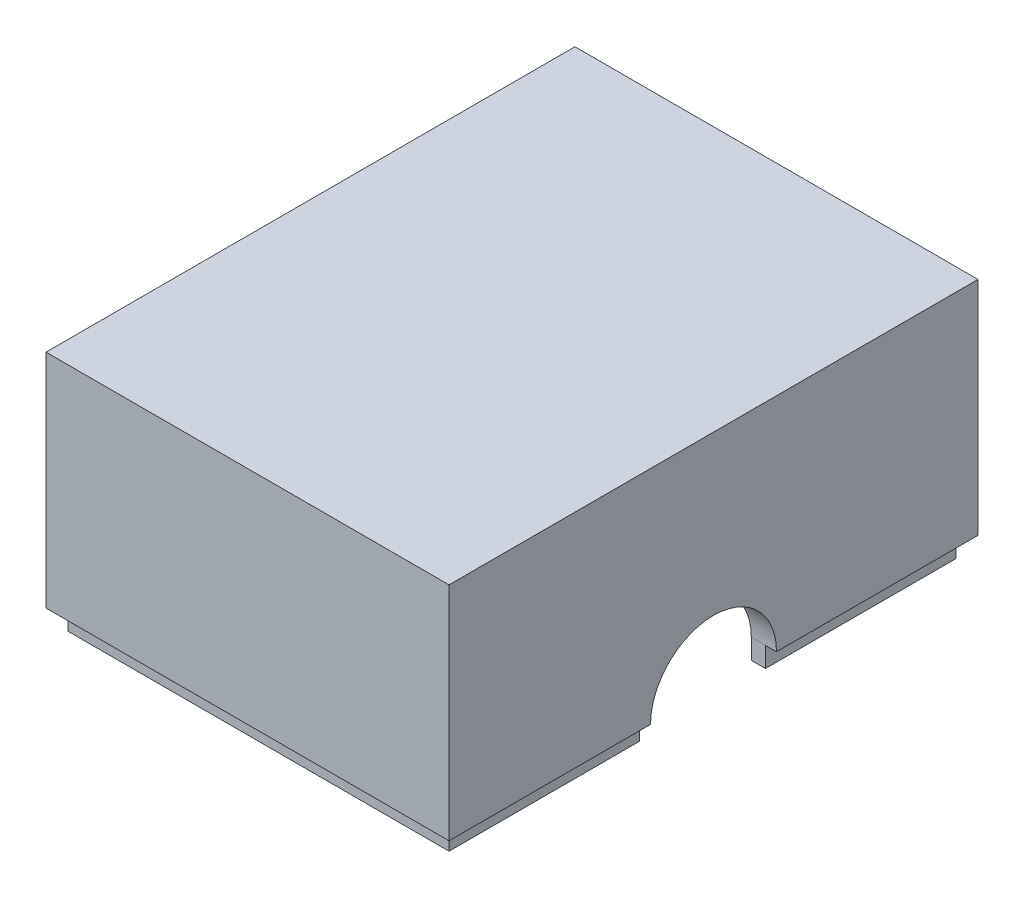
ISO-10303-21;
HEADER;
FILE_DESCRIPTION(('STEP AP214'),'2;1');
FILE_NAME('part.step','',(''),(''),'','','');
FILE_SCHEMA(('AUTOMOTIVE_DESIGN { 1 0 10303 214 1 1 1 1 }'));
ENDSEC;
DATA;
#1=APPLICATION_CONTEXT('core data for automotive mechanical design processes');
#2=APPLICATION_PROTOCOL_DEFINITION('international standard','automotive_design',2000,#1);
#3=PRODUCT_CONTEXT('',#1,'mechanical');
#4=PRODUCT('Part','Part','',(#3));
#5=PRODUCT_RELATED_PRODUCT_CATEGORY('part','',(#4));
#6=PRODUCT_DEFINITION_FORMATION('','',#4);
#7=PRODUCT_DEFINITION_CONTEXT('part definition',#1,'design');
#8=PRODUCT_DEFINITION('design','',#6,#7);
#9=PRODUCT_DEFINITION_SHAPE('','',#8);
#10=(LENGTH_UNIT() NAMED_UNIT(*) SI_UNIT(.MILLI.,.METRE.));
#11=(NAMED_UNIT(*) PLANE_ANGLE_UNIT() SI_UNIT($,.RADIAN.));
#12=(NAMED_UNIT(*) SI_UNIT($,.STERADIAN.) SOLID_ANGLE_UNIT());
#13=UNCERTAINTY_MEASURE_WITH_UNIT(LENGTH_MEASURE(1.E-05),#10,'distance_accuracy_value','');
#14=(GEOMETRIC_REPRESENTATION_CONTEXT(3) GLOBAL_UNCERTAINTY_ASSIGNED_CONTEXT((#13)) GLOBAL_UNIT_ASSIGNED_CONTEXT((#10,
#11,#12)) REPRESENTATION_CONTEXT('',''));
#15=CARTESIAN_POINT('',(0.,0.,0.));
#16=DIRECTION('',(0.,0.,1.));
#17=DIRECTION('',(1.,0.,0.));
#18=AXIS2_PLACEMENT_3D('',#15,#16,#17);
#19=CARTESIAN_POINT('',(0.,0.,0.));
#20=DIRECTION('',(0.,-1.,0.));
#21=DIRECTION('',(0.,0.,-1.));
#22=AXIS2_PLACEMENT_3D('',#19,#20,#21);
#23=PLANE('',#22);
#24=DIRECTION('',(-1.,0.,0.));
#25=VECTOR('',#24,1.);
#26=CARTESIAN_POINT('',(0.,0.,12.5));
#27=LINE('',#26,#25);
#28=CARTESIAN_POINT('',(37.8,0.,12.5));
#29=VERTEX_POINT('',#28);
#30=CARTESIAN_POINT('',(35.,0.,12.5));
#31=VERTEX_POINT('',#30);
#32=EDGE_CURVE('E359',#29,#31,#27,.T.);
#33=ORIENTED_EDGE('',*,*,#32,.F.);
#34=DIRECTION('',(0.,0.,1.));
#35=VECTOR('',#34,1.);
#36=CARTESIAN_POINT('',(37.8,0.,50.3));
#37=LINE('',#36,#35);
#38=CARTESIAN_POINT('',(37.8,0.,50.3));
#39=VERTEX_POINT('',#38);
#40=EDGE_CURVE('E351',#29,#39,#37,.T.);
#41=ORIENTED_EDGE('',*,*,#40,.T.);
#42=DIRECTION('',(-1.,0.,0.));
#43=VECTOR('',#42,1.);
#44=CARTESIAN_POINT('',(-37.8,0.,50.3));
#45=LINE('',#44,#43);
#46=CARTESIAN_POINT('',(-37.8,0.,50.3));
#47=VERTEX_POINT('',#46);
#48=EDGE_CURVE('E295',#39,#47,#45,.T.);
#49=ORIENTED_EDGE('',*,*,#48,.T.);
#50=DIRECTION('',(0.,0.,-1.));
#51=VECTOR('',#50,1.);
#52=CARTESIAN_POINT('',(-37.8,0.,-50.3));
#53=LINE('',#52,#51);
#54=CARTESIAN_POINT('',(-37.8,0.,12.5));
#55=VERTEX_POINT('',#54);
#56=EDGE_CURVE('E294',#47,#55,#53,.T.);
#57=ORIENTED_EDGE('',*,*,#56,.T.);
#58=CARTESIAN_POINT('',(-35.,0.,12.5));
#59=VERTEX_POINT('',#58);
#60=EDGE_CURVE('E366',#59,#55,#27,.T.);
#61=ORIENTED_EDGE('',*,*,#60,.F.);
#62=DIRECTION('',(0.,0.,-1.));
#63=VECTOR('',#62,1.);
#64=CARTESIAN_POINT('',(-35.,0.,-47.5));
#65=LINE('',#64,#63);
#66=CARTESIAN_POINT('',(-35.,0.,47.5));
#67=VERTEX_POINT('',#66);
#68=EDGE_CURVE('E240',#67,#59,#65,.T.);
#69=ORIENTED_EDGE('',*,*,#68,.F.);
#70=DIRECTION('',(-1.,0.,0.));
#71=VECTOR('',#70,1.);
#72=CARTESIAN_POINT('',(-35.,0.,47.5));
#73=LINE('',#72,#71);
#74=CARTESIAN_POINT('',(35.,0.,47.5));
#75=VERTEX_POINT('',#74);
#76=EDGE_CURVE('E236',#75,#67,#73,.T.);
#77=ORIENTED_EDGE('',*,*,#76,.F.);
#78=DIRECTION('',(0.,0.,1.));
#79=VECTOR('',#78,1.);
#80=CARTESIAN_POINT('',(35.,0.,-47.5));
#81=LINE('',#80,#79);
#82=EDGE_CURVE('E218',#31,#75,#81,.T.);
#83=ORIENTED_EDGE('',*,*,#82,.F.);
#84=EDGE_LOOP('',(#33,#41,#49,#57,#61,#69,#77,#83));
#85=FACE_BOUND('',#84,.T.);
#86=ADVANCED_FACE('F33',(#85),#23,.T.);
#87=CARTESIAN_POINT('',(0.,4.,0.));
#88=DIRECTION('',(0.,1.,0.));
#89=DIRECTION('',(0.,0.,1.));
#90=AXIS2_PLACEMENT_3D('',#87,#88,#89);
#91=PLANE('',#90);
#92=DIRECTION('',(0.,0.,-1.));
#93=VECTOR('',#92,1.);
#94=CARTESIAN_POINT('',(-40.,4.,-52.5));
#95=LINE('',#94,#93);
#96=CARTESIAN_POINT('',(-40.,4.,52.5));
#97=VERTEX_POINT('',#96);
#98=CARTESIAN_POINT('',(-40.,4.,12.5));
#99=VERTEX_POINT('',#98);
#100=EDGE_CURVE('E209',#97,#99,#95,.T.);
#101=ORIENTED_EDGE('',*,*,#100,.T.);
#102=DIRECTION('',(1.,0.,0.));
#103=VECTOR('',#102,1.);
#104=CARTESIAN_POINT('',(-40.,4.,12.5));
#105=LINE('',#104,#103);
#106=CARTESIAN_POINT('',(-37.8,4.,12.5));
#107=VERTEX_POINT('',#106);
#108=EDGE_CURVE('E48',#99,#107,#105,.T.);
#109=ORIENTED_EDGE('',*,*,#108,.T.);
#110=DIRECTION('',(0.,0.,-1.));
#111=VECTOR('',#110,1.);
#112=CARTESIAN_POINT('',(-37.8,4.,-50.3));
#113=LINE('',#112,#111);
#114=CARTESIAN_POINT('',(-37.8,4.,50.3));
#115=VERTEX_POINT('',#114);
#116=EDGE_CURVE('E335',#115,#107,#113,.T.);
#117=ORIENTED_EDGE('',*,*,#116,.F.);
#118=DIRECTION('',(-1.,0.,0.));
#119=VECTOR('',#118,1.);
#120=CARTESIAN_POINT('',(-37.8,4.,50.3));
#121=LINE('',#120,#119);
#122=CARTESIAN_POINT('',(37.8,4.,50.3));
#123=VERTEX_POINT('',#122);
#124=EDGE_CURVE('E347',#123,#115,#121,.T.);
#125=ORIENTED_EDGE('',*,*,#124,.F.);
#126=DIRECTION('',(0.,0.,1.));
#127=VECTOR('',#126,1.);
#128=CARTESIAN_POINT('',(37.8,4.,50.3));
#129=LINE('',#128,#127);
#130=CARTESIAN_POINT('',(37.8,4.,12.5));
#131=VERTEX_POINT('',#130);
#132=EDGE_CURVE('E305',#131,#123,#129,.T.);
#133=ORIENTED_EDGE('',*,*,#132,.F.);
#134=CARTESIAN_POINT('',(40.,4.,12.5));
#135=VERTEX_POINT('',#134);
#136=EDGE_CURVE('E201',#131,#135,#105,.T.);
#137=ORIENTED_EDGE('',*,*,#136,.T.);
#138=DIRECTION('',(0.,0.,1.));
#139=VECTOR('',#138,1.);
#140=CARTESIAN_POINT('',(40.,4.,52.5));
#141=LINE('',#140,#139);
#142=CARTESIAN_POINT('',(40.,4.,52.5));
#143=VERTEX_POINT('',#142);
#144=EDGE_CURVE('E308',#135,#143,#141,.T.);
#145=ORIENTED_EDGE('',*,*,#144,.T.);
#146=DIRECTION('',(-1.,0.,0.));
#147=VECTOR('',#146,1.);
#148=CARTESIAN_POINT('',(-40.,4.,52.5));
#149=LINE('',#148,#147);
#150=EDGE_CURVE('E210',#143,#97,#149,.T.);
#151=ORIENTED_EDGE('',*,*,#150,.T.);
#152=EDGE_LOOP('',(#101,#109,#117,#125,#133,#137,#145,#151));
#153=FACE_BOUND('',#152,.T.);
#154=ADVANCED_FACE('F321',(#153),#91,.F.);
#155=CARTESIAN_POINT('',(37.8,4.,50.3));
#156=DIRECTION('',(1.,0.,0.));
#157=DIRECTION('',(0.,0.,-1.));
#158=AXIS2_PLACEMENT_3D('',#155,#156,#157);
#159=PLANE('',#158);
#160=DIRECTION('',(0.,-1.,0.));
#161=VECTOR('',#160,1.);
#162=CARTESIAN_POINT('',(37.8,4.00000000000003,12.5));
#163=LINE('',#162,#161);
#164=EDGE_CURVE('E364',#131,#29,#163,.T.);
#165=ORIENTED_EDGE('',*,*,#164,.F.);
#166=ORIENTED_EDGE('',*,*,#132,.T.);
#167=DIRECTION('',(0.,-1.,0.));
#168=VECTOR('',#167,1.);
#169=CARTESIAN_POINT('',(37.8,4.,50.3));
#170=LINE('',#169,#168);
#171=EDGE_CURVE('E313',#123,#39,#170,.T.);
#172=ORIENTED_EDGE('',*,*,#171,.T.);
#173=ORIENTED_EDGE('',*,*,#40,.F.);
#174=EDGE_LOOP('',(#165,#166,#172,#173));
#175=FACE_BOUND('',#174,.T.);
#176=ADVANCED_FACE('F377',(#175),#159,.T.);
#177=CARTESIAN_POINT('',(-37.8,4.,-50.3));
#178=DIRECTION('',(-1.,0.,0.));
#179=DIRECTION('',(0.,0.,1.));
#180=AXIS2_PLACEMENT_3D('',#177,#178,#179);
#181=PLANE('',#180);
#182=DIRECTION('',(0.,1.,0.));
#183=VECTOR('',#182,1.);
#184=CARTESIAN_POINT('',(-37.8,3.99999999999994,12.5));
#185=LINE('',#184,#183);
#186=EDGE_CURVE('E11',#55,#107,#185,.T.);
#187=ORIENTED_EDGE('',*,*,#186,.F.);
#188=ORIENTED_EDGE('',*,*,#56,.F.);
#189=DIRECTION('',(0.,-1.,0.));
#190=VECTOR('',#189,1.);
#191=CARTESIAN_POINT('',(-37.8,4.,50.3));
#192=LINE('',#191,#190);
#193=EDGE_CURVE('E310',#115,#47,#192,.T.);
#194=ORIENTED_EDGE('',*,*,#193,.F.);
#195=ORIENTED_EDGE('',*,*,#116,.T.);
#196=EDGE_LOOP('',(#187,#188,#194,#195));
#197=FACE_BOUND('',#196,.T.);
#198=ADVANCED_FACE('F342',(#197),#181,.T.);
#199=DIRECTION('',(1.,0.,0.));
#200=VECTOR('',#199,1.);
#201=CARTESIAN_POINT('',(0.,0.,-12.5));
#202=LINE('',#201,#200);
#203=CARTESIAN_POINT('',(-37.8,0.,-12.5));
#204=VERTEX_POINT('',#203);
#205=CARTESIAN_POINT('',(-35.,0.,-12.5));
#206=VERTEX_POINT('',#205);
#207=EDGE_CURVE('E275',#204,#206,#202,.T.);
#208=ORIENTED_EDGE('',*,*,#207,.F.);
#209=CARTESIAN_POINT('',(-37.8,0.,-50.3));
#210=VERTEX_POINT('',#209);
#211=EDGE_CURVE('E283',#204,#210,#53,.T.);
#212=ORIENTED_EDGE('',*,*,#211,.T.);
#213=DIRECTION('',(1.,0.,0.));
#214=VECTOR('',#213,1.);
#215=CARTESIAN_POINT('',(37.8,0.,-50.3));
#216=LINE('',#215,#214);
#217=CARTESIAN_POINT('',(37.8,0.,-50.3));
#218=VERTEX_POINT('',#217);
#219=EDGE_CURVE('E298',#210,#218,#216,.T.);
#220=ORIENTED_EDGE('',*,*,#219,.T.);
#221=CARTESIAN_POINT('',(37.8,0.,-12.5));
#222=VERTEX_POINT('',#221);
#223=EDGE_CURVE('E300',#218,#222,#37,.T.);
#224=ORIENTED_EDGE('',*,*,#223,.T.);
#225=CARTESIAN_POINT('',(35.,0.,-12.5));
#226=VERTEX_POINT('',#225);
#227=EDGE_CURVE('E289',#226,#222,#202,.T.);
#228=ORIENTED_EDGE('',*,*,#227,.F.);
#229=CARTESIAN_POINT('',(35.,0.,-47.5));
#230=VERTEX_POINT('',#229);
#231=EDGE_CURVE('E233',#230,#226,#81,.T.);
#232=ORIENTED_EDGE('',*,*,#231,.F.);
#233=DIRECTION('',(1.,0.,0.));
#234=VECTOR('',#233,1.);
#235=CARTESIAN_POINT('',(-35.,0.,-47.5));
#236=LINE('',#235,#234);
#237=CARTESIAN_POINT('',(-35.,0.,-47.5));
#238=VERTEX_POINT('',#237);
#239=EDGE_CURVE('E223',#238,#230,#236,.T.);
#240=ORIENTED_EDGE('',*,*,#239,.F.);
#241=EDGE_CURVE('E239',#206,#238,#65,.T.);
#242=ORIENTED_EDGE('',*,*,#241,.F.);
#243=EDGE_LOOP('',(#208,#212,#220,#224,#228,#232,#240,#242));
#244=FACE_BOUND('',#243,.T.);
#245=ADVANCED_FACE('F281',(#244),#23,.T.);
#246=CARTESIAN_POINT('',(35.,45.,-47.5));
#247=DIRECTION('',(1.,0.,0.));
#248=DIRECTION('',(0.,0.,-1.));
#249=AXIS2_PLACEMENT_3D('',#246,#247,#248);
#250=PLANE('',#249);
#251=CARTESIAN_POINT('',(35.,4.,0.));
#252=DIRECTION('',(1.,0.,0.));
#253=DIRECTION('',(0.,0.,-1.));
#254=AXIS2_PLACEMENT_3D('',#251,#252,#253);
#255=CIRCLE('',#254,12.5);
#256=CARTESIAN_POINT('',(35.,4.,-12.5));
#257=VERTEX_POINT('',#256);
#258=CARTESIAN_POINT('',(35.,4.,12.5));
#259=VERTEX_POINT('',#258);
#260=EDGE_CURVE('E287',#257,#259,#255,.T.);
#261=ORIENTED_EDGE('',*,*,#260,.T.);
#262=DIRECTION('',(0.,-1.,0.));
#263=VECTOR('',#262,1.);
#264=CARTESIAN_POINT('',(35.,44.9999999999999,12.5));
#265=LINE('',#264,#263);
#266=EDGE_CURVE('E354',#259,#31,#265,.T.);
#267=ORIENTED_EDGE('',*,*,#266,.T.);
#268=ORIENTED_EDGE('',*,*,#82,.T.);
#269=DIRECTION('',(0.,-1.,0.));
#270=VECTOR('',#269,1.);
#271=CARTESIAN_POINT('',(35.,45.,47.5));
#272=LINE('',#271,#270);
#273=CARTESIAN_POINT('',(35.,45.,47.5));
#274=VERTEX_POINT('',#273);
#275=EDGE_CURVE('E232',#274,#75,#272,.T.);
#276=ORIENTED_EDGE('',*,*,#275,.F.);
#277=DIRECTION('',(0.,0.,1.));
#278=VECTOR('',#277,1.);
#279=CARTESIAN_POINT('',(35.,45.,-47.5));
#280=LINE('',#279,#278);
#281=CARTESIAN_POINT('',(35.,45.,-47.5));
#282=VERTEX_POINT('',#281);
#283=EDGE_CURVE('E219',#282,#274,#280,.T.);
#284=ORIENTED_EDGE('',*,*,#283,.F.);
#285=DIRECTION('',(0.,-1.,0.));
#286=VECTOR('',#285,1.);
#287=CARTESIAN_POINT('',(35.,45.,-47.5));
#288=LINE('',#287,#286);
#289=EDGE_CURVE('E245',#282,#230,#288,.T.);
#290=ORIENTED_EDGE('',*,*,#289,.T.);
#291=ORIENTED_EDGE('',*,*,#231,.T.);
#292=DIRECTION('',(0.,1.,0.));
#293=VECTOR('',#292,1.);
#294=CARTESIAN_POINT('',(35.,45.,-12.5));
#295=LINE('',#294,#293);
#296=EDGE_CURVE('E386',#226,#257,#295,.T.);
#297=ORIENTED_EDGE('',*,*,#296,.T.);
#298=EDGE_LOOP('',(#261,#267,#268,#276,#284,#290,#291,#297));
#299=FACE_BOUND('',#298,.T.);
#300=ADVANCED_FACE('F395',(#299),#250,.F.);
#301=CARTESIAN_POINT('',(-35.,45.,-47.5));
#302=DIRECTION('',(0.,0.,-1.));
#303=DIRECTION('',(-1.,0.,0.));
#304=AXIS2_PLACEMENT_3D('',#301,#302,#303);
#305=PLANE('',#304);
#306=ORIENTED_EDGE('',*,*,#239,.T.);
#307=ORIENTED_EDGE('',*,*,#289,.F.);
#308=DIRECTION('',(1.,0.,0.));
#309=VECTOR('',#308,1.);
#310=CARTESIAN_POINT('',(-35.,45.,-47.5));
#311=LINE('',#310,#309);
#312=CARTESIAN_POINT('',(-35.,45.,-47.5));
#313=VERTEX_POINT('',#312);
#314=EDGE_CURVE('E229',#313,#282,#311,.T.);
#315=ORIENTED_EDGE('',*,*,#314,.F.);
#316=DIRECTION('',(0.,-1.,0.));
#317=VECTOR('',#316,1.);
#318=CARTESIAN_POINT('',(-35.,45.,-47.5));
#319=LINE('',#318,#317);
#320=EDGE_CURVE('E248',#313,#238,#319,.T.);
#321=ORIENTED_EDGE('',*,*,#320,.T.);
#322=EDGE_LOOP('',(#306,#307,#315,#321));
#323=FACE_BOUND('',#322,.T.);
#324=ADVANCED_FACE('F401',(#323),#305,.F.);
#325=CARTESIAN_POINT('',(-35.,45.,-47.5));
#326=DIRECTION('',(-1.,0.,0.));
#327=DIRECTION('',(0.,0.,1.));
#328=AXIS2_PLACEMENT_3D('',#325,#326,#327);
#329=PLANE('',#328);
#330=ORIENTED_EDGE('',*,*,#68,.T.);
#331=DIRECTION('',(0.,1.,0.));
#332=VECTOR('',#331,1.);
#333=CARTESIAN_POINT('',(-35.,44.9999999999999,12.5));
#334=LINE('',#333,#332);
#335=CARTESIAN_POINT('',(-35.,4.,12.5));
#336=VERTEX_POINT('',#335);
#337=EDGE_CURVE('E385',#59,#336,#334,.T.);
#338=ORIENTED_EDGE('',*,*,#337,.T.);
#339=CARTESIAN_POINT('',(-35.,4.,0.));
#340=DIRECTION('',(-1.,0.,0.));
#341=DIRECTION('',(0.,0.,1.));
#342=AXIS2_PLACEMENT_3D('',#339,#340,#341);
#343=CIRCLE('',#342,12.5);
#344=CARTESIAN_POINT('',(-35.,4.,-12.5));
#345=VERTEX_POINT('',#344);
#346=EDGE_CURVE('E337',#336,#345,#343,.T.);
#347=ORIENTED_EDGE('',*,*,#346,.T.);
#348=DIRECTION('',(0.,-1.,0.));
#349=VECTOR('',#348,1.);
#350=CARTESIAN_POINT('',(-35.,45.,-12.5));
#351=LINE('',#350,#349);
#352=EDGE_CURVE('E286',#345,#206,#351,.T.);
#353=ORIENTED_EDGE('',*,*,#352,.T.);
#354=ORIENTED_EDGE('',*,*,#241,.T.);
#355=ORIENTED_EDGE('',*,*,#320,.F.);
#356=DIRECTION('',(0.,0.,-1.));
#357=VECTOR('',#356,1.);
#358=CARTESIAN_POINT('',(-35.,45.,-47.5));
#359=LINE('',#358,#357);
#360=CARTESIAN_POINT('',(-35.,45.,47.5));
#361=VERTEX_POINT('',#360);
#362=EDGE_CURVE('E226',#361,#313,#359,.T.);
#363=ORIENTED_EDGE('',*,*,#362,.F.);
#364=DIRECTION('',(0.,-1.,0.));
#365=VECTOR('',#364,1.);
#366=CARTESIAN_POINT('',(-35.,45.,47.5));
#367=LINE('',#366,#365);
#368=EDGE_CURVE('E251',#361,#67,#367,.T.);
#369=ORIENTED_EDGE('',*,*,#368,.T.);
#370=EDGE_LOOP('',(#330,#338,#347,#353,#354,#355,#363,#369));
#371=FACE_BOUND('',#370,.T.);
#372=ADVANCED_FACE('F389',(#371),#329,.F.);
#373=CARTESIAN_POINT('',(-35.,45.,47.5));
#374=DIRECTION('',(0.,0.,1.));
#375=DIRECTION('',(1.,0.,0.));
#376=AXIS2_PLACEMENT_3D('',#373,#374,#375);
#377=PLANE('',#376);
#378=ORIENTED_EDGE('',*,*,#76,.T.);
#379=ORIENTED_EDGE('',*,*,#368,.F.);
#380=DIRECTION('',(-1.,0.,0.));
#381=VECTOR('',#380,1.);
#382=CARTESIAN_POINT('',(-35.,45.,47.5));
#383=LINE('',#382,#381);
#384=EDGE_CURVE('E222',#274,#361,#383,.T.);
#385=ORIENTED_EDGE('',*,*,#384,.F.);
#386=ORIENTED_EDGE('',*,*,#275,.T.);
#387=EDGE_LOOP('',(#378,#379,#385,#386));
#388=FACE_BOUND('',#387,.T.);
#389=ADVANCED_FACE('F394',(#388),#377,.F.);
#390=CARTESIAN_POINT('',(0.,45.,0.));
#391=DIRECTION('',(0.,1.,0.));
#392=DIRECTION('',(0.,0.,1.));
#393=AXIS2_PLACEMENT_3D('',#390,#391,#392);
#394=PLANE('',#393);
#395=ORIENTED_EDGE('',*,*,#283,.T.);
#396=ORIENTED_EDGE('',*,*,#384,.T.);
#397=ORIENTED_EDGE('',*,*,#362,.T.);
#398=ORIENTED_EDGE('',*,*,#314,.T.);
#399=EDGE_LOOP('',(#395,#396,#397,#398));
#400=FACE_BOUND('',#399,.T.);
#401=ADVANCED_FACE('F398',(#400),#394,.F.);
#402=CARTESIAN_POINT('',(40.,4.,-52.5));
#403=VERTEX_POINT('',#402);
#404=CARTESIAN_POINT('',(40.,4.,-12.5));
#405=VERTEX_POINT('',#404);
#406=EDGE_CURVE('E213',#403,#405,#141,.T.);
#407=ORIENTED_EDGE('',*,*,#406,.T.);
#408=DIRECTION('',(1.,0.,0.));
#409=VECTOR('',#408,1.);
#410=CARTESIAN_POINT('',(-40.,4.,-12.5));
#411=LINE('',#410,#409);
#412=CARTESIAN_POINT('',(37.8,4.,-12.5));
#413=VERTEX_POINT('',#412);
#414=EDGE_CURVE('E56',#413,#405,#411,.T.);
#415=ORIENTED_EDGE('',*,*,#414,.F.);
#416=CARTESIAN_POINT('',(37.8,4.,-50.3));
#417=VERTEX_POINT('',#416);
#418=EDGE_CURVE('E369',#417,#413,#129,.T.);
#419=ORIENTED_EDGE('',*,*,#418,.F.);
#420=DIRECTION('',(1.,0.,0.));
#421=VECTOR('',#420,1.);
#422=CARTESIAN_POINT('',(37.8,4.,-50.3));
#423=LINE('',#422,#421);
#424=CARTESIAN_POINT('',(-37.8,4.,-50.3));
#425=VERTEX_POINT('',#424);
#426=EDGE_CURVE('E315',#425,#417,#423,.T.);
#427=ORIENTED_EDGE('',*,*,#426,.F.);
#428=CARTESIAN_POINT('',(-37.8,4.,-12.5));
#429=VERTEX_POINT('',#428);
#430=EDGE_CURVE('E200',#429,#425,#113,.T.);
#431=ORIENTED_EDGE('',*,*,#430,.F.);
#432=CARTESIAN_POINT('',(-40.,4.,-12.5));
#433=VERTEX_POINT('',#432);
#434=EDGE_CURVE('E185',#433,#429,#411,.T.);
#435=ORIENTED_EDGE('',*,*,#434,.F.);
#436=CARTESIAN_POINT('',(-40.,4.,-52.5));
#437=VERTEX_POINT('',#436);
#438=EDGE_CURVE('E197',#433,#437,#95,.T.);
#439=ORIENTED_EDGE('',*,*,#438,.T.);
#440=DIRECTION('',(1.,0.,0.));
#441=VECTOR('',#440,1.);
#442=CARTESIAN_POINT('',(40.,4.,-52.5));
#443=LINE('',#442,#441);
#444=EDGE_CURVE('E212',#437,#403,#443,.T.);
#445=ORIENTED_EDGE('',*,*,#444,.T.);
#446=EDGE_LOOP('',(#407,#415,#419,#427,#431,#435,#439,#445));
#447=FACE_BOUND('',#446,.T.);
#448=ADVANCED_FACE('F196',(#447),#91,.F.);
#449=DIRECTION('',(0.,1.,0.));
#450=VECTOR('',#449,1.);
#451=CARTESIAN_POINT('',(37.8,4.00000000000003,-12.5));
#452=LINE('',#451,#450);
#453=EDGE_CURVE('E405',#222,#413,#452,.T.);
#454=ORIENTED_EDGE('',*,*,#453,.F.);
#455=ORIENTED_EDGE('',*,*,#223,.F.);
#456=DIRECTION('',(0.,-1.,0.));
#457=VECTOR('',#456,1.);
#458=CARTESIAN_POINT('',(37.8,4.,-50.3));
#459=LINE('',#458,#457);
#460=EDGE_CURVE('E306',#417,#218,#459,.T.);
#461=ORIENTED_EDGE('',*,*,#460,.F.);
#462=ORIENTED_EDGE('',*,*,#418,.T.);
#463=EDGE_LOOP('',(#454,#455,#461,#462));
#464=FACE_BOUND('',#463,.T.);
#465=ADVANCED_FACE('F450',(#464),#159,.T.);
#466=CARTESIAN_POINT('',(37.8,4.,-50.3));
#467=DIRECTION('',(0.,0.,-1.));
#468=DIRECTION('',(-1.,0.,0.));
#469=AXIS2_PLACEMENT_3D('',#466,#467,#468);
#470=PLANE('',#469);
#471=ORIENTED_EDGE('',*,*,#219,.F.);
#472=DIRECTION('',(0.,-1.,0.));
#473=VECTOR('',#472,1.);
#474=CARTESIAN_POINT('',(-37.8,4.,-50.3));
#475=LINE('',#474,#473);
#476=EDGE_CURVE('E292',#425,#210,#475,.T.);
#477=ORIENTED_EDGE('',*,*,#476,.F.);
#478=ORIENTED_EDGE('',*,*,#426,.T.);
#479=ORIENTED_EDGE('',*,*,#460,.T.);
#480=EDGE_LOOP('',(#471,#477,#478,#479));
#481=FACE_BOUND('',#480,.T.);
#482=ADVANCED_FACE('F454',(#481),#470,.T.);
#483=DIRECTION('',(0.,-1.,0.));
#484=VECTOR('',#483,1.);
#485=CARTESIAN_POINT('',(-37.8,3.99999999999998,-12.5));
#486=LINE('',#485,#484);
#487=EDGE_CURVE('E41',#429,#204,#486,.T.);
#488=ORIENTED_EDGE('',*,*,#487,.F.);
#489=ORIENTED_EDGE('',*,*,#430,.T.);
#490=ORIENTED_EDGE('',*,*,#476,.T.);
#491=ORIENTED_EDGE('',*,*,#211,.F.);
#492=EDGE_LOOP('',(#488,#489,#490,#491));
#493=FACE_BOUND('',#492,.T.);
#494=ADVANCED_FACE('F290',(#493),#181,.T.);
#495=CARTESIAN_POINT('',(-37.8,4.,50.3));
#496=DIRECTION('',(0.,0.,1.));
#497=DIRECTION('',(1.,0.,0.));
#498=AXIS2_PLACEMENT_3D('',#495,#496,#497);
#499=PLANE('',#498);
#500=ORIENTED_EDGE('',*,*,#48,.F.);
#501=ORIENTED_EDGE('',*,*,#171,.F.);
#502=ORIENTED_EDGE('',*,*,#124,.T.);
#503=ORIENTED_EDGE('',*,*,#193,.T.);
#504=EDGE_LOOP('',(#500,#501,#502,#503));
#505=FACE_BOUND('',#504,.T.);
#506=ADVANCED_FACE('F380',(#505),#499,.T.);
#507=CARTESIAN_POINT('',(0.,48.,0.));
#508=DIRECTION('',(0.,-1.,0.));
#509=DIRECTION('',(0.,0.,-1.));
#510=AXIS2_PLACEMENT_3D('',#507,#508,#509);
#511=PLANE('',#510);
#512=DIRECTION('',(0.,0.,-1.));
#513=VECTOR('',#512,1.);
#514=CARTESIAN_POINT('',(40.,48.,52.5));
#515=LINE('',#514,#513);
#516=CARTESIAN_POINT('',(40.,48.,52.5));
#517=VERTEX_POINT('',#516);
#518=CARTESIAN_POINT('',(40.,48.,-52.5));
#519=VERTEX_POINT('',#518);
#520=EDGE_CURVE('E247',#517,#519,#515,.T.);
#521=ORIENTED_EDGE('',*,*,#520,.T.);
#522=DIRECTION('',(-1.,0.,0.));
#523=VECTOR('',#522,1.);
#524=CARTESIAN_POINT('',(-40.,48.,-52.5));
#525=LINE('',#524,#523);
#526=CARTESIAN_POINT('',(-40.,48.,-52.5));
#527=VERTEX_POINT('',#526);
#528=EDGE_CURVE('E257',#519,#527,#525,.T.);
#529=ORIENTED_EDGE('',*,*,#528,.T.);
#530=DIRECTION('',(0.,0.,1.));
#531=VECTOR('',#530,1.);
#532=CARTESIAN_POINT('',(-40.,48.,52.5));
#533=LINE('',#532,#531);
#534=CARTESIAN_POINT('',(-40.,48.,52.5));
#535=VERTEX_POINT('',#534);
#536=EDGE_CURVE('E259',#527,#535,#533,.T.);
#537=ORIENTED_EDGE('',*,*,#536,.T.);
#538=DIRECTION('',(1.,0.,0.));
#539=VECTOR('',#538,1.);
#540=CARTESIAN_POINT('',(-40.,48.,52.5));
#541=LINE('',#540,#539);
#542=EDGE_CURVE('E261',#535,#517,#541,.T.);
#543=ORIENTED_EDGE('',*,*,#542,.T.);
#544=EDGE_LOOP('',(#521,#529,#537,#543));
#545=FACE_BOUND('',#544,.T.);
#546=ADVANCED_FACE('F332',(#545),#511,.F.);
#547=CARTESIAN_POINT('',(-40.,48.,52.5));
#548=DIRECTION('',(0.,0.,-1.));
#549=DIRECTION('',(-1.,0.,0.));
#550=AXIS2_PLACEMENT_3D('',#547,#548,#549);
#551=PLANE('',#550);
#552=DIRECTION('',(0.,-1.,0.));
#553=VECTOR('',#552,1.);
#554=CARTESIAN_POINT('',(-40.,48.,52.5));
#555=LINE('',#554,#553);
#556=EDGE_CURVE('E266',#535,#97,#555,.T.);
#557=ORIENTED_EDGE('',*,*,#556,.T.);
#558=ORIENTED_EDGE('',*,*,#150,.F.);
#559=DIRECTION('',(0.,-1.,0.));
#560=VECTOR('',#559,1.);
#561=CARTESIAN_POINT('',(40.,48.,52.5));
#562=LINE('',#561,#560);
#563=EDGE_CURVE('E263',#517,#143,#562,.T.);
#564=ORIENTED_EDGE('',*,*,#563,.F.);
#565=ORIENTED_EDGE('',*,*,#542,.F.);
#566=EDGE_LOOP('',(#557,#558,#564,#565));
#567=FACE_BOUND('',#566,.T.);
#568=ADVANCED_FACE('F326',(#567),#551,.F.);
#569=CARTESIAN_POINT('',(-40.,48.,52.5));
#570=DIRECTION('',(1.,0.,0.));
#571=DIRECTION('',(0.,0.,-1.));
#572=AXIS2_PLACEMENT_3D('',#569,#570,#571);
#573=PLANE('',#572);
#574=ORIENTED_EDGE('',*,*,#438,.F.);
#575=CARTESIAN_POINT('',(-40.,4.,0.));
#576=DIRECTION('',(1.,0.,0.));
#577=DIRECTION('',(0.,0.,-1.));
#578=AXIS2_PLACEMENT_3D('',#575,#576,#577);
#579=CIRCLE('',#578,12.5);
#580=EDGE_CURVE('E181',#433,#99,#579,.T.);
#581=ORIENTED_EDGE('',*,*,#580,.T.);
#582=ORIENTED_EDGE('',*,*,#100,.F.);
#583=ORIENTED_EDGE('',*,*,#556,.F.);
#584=ORIENTED_EDGE('',*,*,#536,.F.);
#585=DIRECTION('',(0.,-1.,0.));
#586=VECTOR('',#585,1.);
#587=CARTESIAN_POINT('',(-40.,48.,-52.5));
#588=LINE('',#587,#586);
#589=EDGE_CURVE('E208',#527,#437,#588,.T.);
#590=ORIENTED_EDGE('',*,*,#589,.T.);
#591=EDGE_LOOP('',(#574,#581,#582,#583,#584,#590));
#592=FACE_BOUND('',#591,.T.);
#593=ADVANCED_FACE('F205',(#592),#573,.F.);
#594=CARTESIAN_POINT('',(-40.,48.,-52.5));
#595=DIRECTION('',(0.,0.,1.));
#596=DIRECTION('',(1.,0.,0.));
#597=AXIS2_PLACEMENT_3D('',#594,#595,#596);
#598=PLANE('',#597);
#599=DIRECTION('',(0.,-1.,0.));
#600=VECTOR('',#599,1.);
#601=CARTESIAN_POINT('',(40.,48.,-52.5));
#602=LINE('',#601,#600);
#603=EDGE_CURVE('E270',#519,#403,#602,.T.);
#604=ORIENTED_EDGE('',*,*,#603,.T.);
#605=ORIENTED_EDGE('',*,*,#444,.F.);
#606=ORIENTED_EDGE('',*,*,#589,.F.);
#607=ORIENTED_EDGE('',*,*,#528,.F.);
#608=EDGE_LOOP('',(#604,#605,#606,#607));
#609=FACE_BOUND('',#608,.T.);
#610=ADVANCED_FACE('F468',(#609),#598,.F.);
#611=CARTESIAN_POINT('',(40.,48.,52.5));
#612=DIRECTION('',(-1.,0.,0.));
#613=DIRECTION('',(0.,0.,1.));
#614=AXIS2_PLACEMENT_3D('',#611,#612,#613);
#615=PLANE('',#614);
#616=ORIENTED_EDGE('',*,*,#144,.F.);
#617=CARTESIAN_POINT('',(40.,4.,0.));
#618=DIRECTION('',(1.,0.,0.));
#619=DIRECTION('',(0.,0.,-1.));
#620=AXIS2_PLACEMENT_3D('',#617,#618,#619);
#621=CIRCLE('',#620,12.5);
#622=EDGE_CURVE('E191',#405,#135,#621,.T.);
#623=ORIENTED_EDGE('',*,*,#622,.F.);
#624=ORIENTED_EDGE('',*,*,#406,.F.);
#625=ORIENTED_EDGE('',*,*,#603,.F.);
#626=ORIENTED_EDGE('',*,*,#520,.F.);
#627=ORIENTED_EDGE('',*,*,#563,.T.);
#628=EDGE_LOOP('',(#616,#623,#624,#625,#626,#627));
#629=FACE_BOUND('',#628,.T.);
#630=ADVANCED_FACE('F35',(#629),#615,.F.);
#631=CARTESIAN_POINT('',(-40.,4.,0.));
#632=DIRECTION('',(1.,0.,0.));
#633=DIRECTION('',(0.,0.,-1.));
#634=AXIS2_PLACEMENT_3D('',#631,#632,#633);
#635=CYLINDRICAL_SURFACE('',#634,12.5);
#636=EDGE_CURVE('E420',#257,#413,#411,.T.);
#637=ORIENTED_EDGE('',*,*,#636,.T.);
#638=ORIENTED_EDGE('',*,*,#414,.T.);
#639=ORIENTED_EDGE('',*,*,#622,.T.);
#640=ORIENTED_EDGE('',*,*,#136,.F.);
#641=EDGE_CURVE('E415',#259,#131,#105,.T.);
#642=ORIENTED_EDGE('',*,*,#641,.F.);
#643=ORIENTED_EDGE('',*,*,#260,.F.);
#644=EDGE_LOOP('',(#637,#638,#639,#640,#642,#643));
#645=FACE_BOUND('',#644,.T.);
#646=ADVANCED_FACE('F419',(#645),#635,.F.);
#647=CARTESIAN_POINT('',(-40.,4.,-12.5));
#648=DIRECTION('',(0.,0.,-1.));
#649=DIRECTION('',(0.,1.,0.));
#650=AXIS2_PLACEMENT_3D('',#647,#648,#649);
#651=PLANE('',#650);
#652=ORIENTED_EDGE('',*,*,#227,.T.);
#653=ORIENTED_EDGE('',*,*,#453,.T.);
#654=ORIENTED_EDGE('',*,*,#636,.F.);
#655=ORIENTED_EDGE('',*,*,#296,.F.);
#656=EDGE_LOOP('',(#652,#653,#654,#655));
#657=FACE_BOUND('',#656,.T.);
#658=ADVANCED_FACE('F421',(#657),#651,.F.);
#659=CARTESIAN_POINT('',(-40.,4.,12.5));
#660=DIRECTION('',(0.,0.,1.));
#661=DIRECTION('',(0.,-1.,0.));
#662=AXIS2_PLACEMENT_3D('',#659,#660,#661);
#663=PLANE('',#662);
#664=ORIENTED_EDGE('',*,*,#641,.T.);
#665=ORIENTED_EDGE('',*,*,#164,.T.);
#666=ORIENTED_EDGE('',*,*,#32,.T.);
#667=ORIENTED_EDGE('',*,*,#266,.F.);
#668=EDGE_LOOP('',(#664,#665,#666,#667));
#669=FACE_BOUND('',#668,.T.);
#670=ADVANCED_FACE('F413',(#669),#663,.F.);
#671=ORIENTED_EDGE('',*,*,#60,.T.);
#672=ORIENTED_EDGE('',*,*,#186,.T.);
#673=EDGE_CURVE('E338',#107,#336,#105,.T.);
#674=ORIENTED_EDGE('',*,*,#673,.T.);
#675=ORIENTED_EDGE('',*,*,#337,.F.);
#676=EDGE_LOOP('',(#671,#672,#674,#675));
#677=FACE_BOUND('',#676,.T.);
#678=ADVANCED_FACE('F422',(#677),#663,.F.);
#679=EDGE_CURVE('E202',#429,#345,#411,.T.);
#680=ORIENTED_EDGE('',*,*,#679,.F.);
#681=ORIENTED_EDGE('',*,*,#487,.T.);
#682=ORIENTED_EDGE('',*,*,#207,.T.);
#683=ORIENTED_EDGE('',*,*,#352,.F.);
#684=EDGE_LOOP('',(#680,#681,#682,#683));
#685=FACE_BOUND('',#684,.T.);
#686=ADVANCED_FACE('F274',(#685),#651,.F.);
#687=ORIENTED_EDGE('',*,*,#673,.F.);
#688=ORIENTED_EDGE('',*,*,#108,.F.);
#689=ORIENTED_EDGE('',*,*,#580,.F.);
#690=ORIENTED_EDGE('',*,*,#434,.T.);
#691=ORIENTED_EDGE('',*,*,#679,.T.);
#692=ORIENTED_EDGE('',*,*,#346,.F.);
#693=EDGE_LOOP('',(#687,#688,#689,#690,#691,#692));
#694=FACE_BOUND('',#693,.T.);
#695=ADVANCED_FACE('F183',(#694),#635,.F.);
#696=CLOSED_SHELL('',(#86,#154,#176,#198,#245,#300,#324,#372,#389,#401,#448,#465,#482,#494,#506,
#546,#568,#593,#610,#630,#646,#658,#670,#678,#686,#695));
#697=MANIFOLD_SOLID_BREP('B2',#696);
#698=ADVANCED_BREP_SHAPE_REPRESENTATION('',(#18,#697),#14);
#699=SHAPE_DEFINITION_REPRESENTATION(#9,#698);
ENDSEC;
END-ISO-10303-21;
